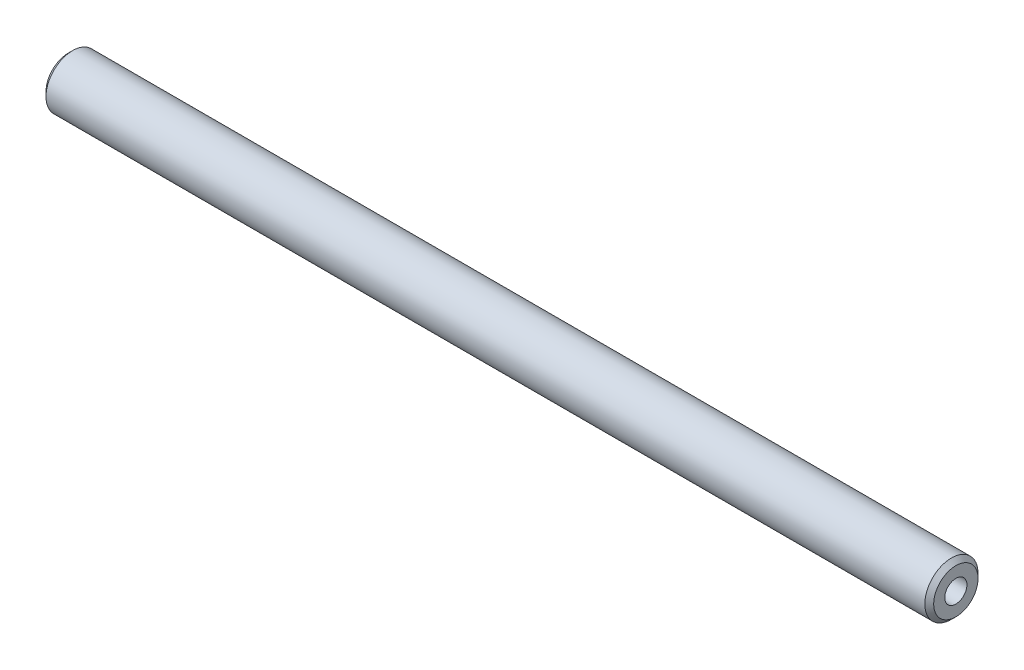
ISO-10303-21;
HEADER;
FILE_DESCRIPTION(('STEP AP214'),'2;1');
FILE_NAME('part.step','',(''),(''),'','','');
FILE_SCHEMA(('AUTOMOTIVE_DESIGN { 1 0 10303 214 1 1 1 1 }'));
ENDSEC;
DATA;
#1=APPLICATION_CONTEXT('core data for automotive mechanical design processes');
#2=APPLICATION_PROTOCOL_DEFINITION('international standard','automotive_design',2000,#1);
#3=PRODUCT_CONTEXT('',#1,'mechanical');
#4=PRODUCT('Part','Part','',(#3));
#5=PRODUCT_RELATED_PRODUCT_CATEGORY('part','',(#4));
#6=PRODUCT_DEFINITION_FORMATION('','',#4);
#7=PRODUCT_DEFINITION_CONTEXT('part definition',#1,'design');
#8=PRODUCT_DEFINITION('design','',#6,#7);
#9=PRODUCT_DEFINITION_SHAPE('','',#8);
#10=(LENGTH_UNIT() NAMED_UNIT(*) SI_UNIT(.MILLI.,.METRE.));
#11=(NAMED_UNIT(*) PLANE_ANGLE_UNIT() SI_UNIT($,.RADIAN.));
#12=(NAMED_UNIT(*) SI_UNIT($,.STERADIAN.) SOLID_ANGLE_UNIT());
#13=UNCERTAINTY_MEASURE_WITH_UNIT(LENGTH_MEASURE(1.E-05),#10,'distance_accuracy_value','');
#14=(GEOMETRIC_REPRESENTATION_CONTEXT(3) GLOBAL_UNCERTAINTY_ASSIGNED_CONTEXT((#13)) GLOBAL_UNIT_ASSIGNED_CONTEXT((#10,
#11,#12)) REPRESENTATION_CONTEXT('',''));
#15=CARTESIAN_POINT('',(0.,0.,0.));
#16=DIRECTION('',(0.,0.,1.));
#17=DIRECTION('',(1.,0.,0.));
#18=AXIS2_PLACEMENT_3D('',#15,#16,#17);
#19=CARTESIAN_POINT('',(0.,0.,0.));
#20=DIRECTION('',(1.,0.,0.));
#21=DIRECTION('',(0.,0.,-1.));
#22=AXIS2_PLACEMENT_3D('',#19,#20,#21);
#23=PLANE('',#22);
#24=CARTESIAN_POINT('',(0.,0.,0.));
#25=DIRECTION('',(1.,0.,0.));
#26=DIRECTION('',(0.,0.,-1.));
#27=AXIS2_PLACEMENT_3D('',#24,#25,#26);
#28=CIRCLE('',#27,2.5);
#29=CARTESIAN_POINT('',(0.,0.,-2.5));
#30=VERTEX_POINT('',#29);
#31=EDGE_CURVE('E82',#30,#30,#28,.F.);
#32=ORIENTED_EDGE('',*,*,#31,.T.);
#33=EDGE_LOOP('',(#32));
#34=FACE_BOUND('',#33,.T.);
#35=CARTESIAN_POINT('',(0.,0.,0.));
#36=DIRECTION('',(-1.,0.,0.));
#37=DIRECTION('',(0.,0.,1.));
#38=AXIS2_PLACEMENT_3D('',#35,#36,#37);
#39=CIRCLE('',#38,1.25);
#40=CARTESIAN_POINT('',(0.,0.,1.25));
#41=VERTEX_POINT('',#40);
#42=EDGE_CURVE('E70',#41,#41,#39,.T.);
#43=ORIENTED_EDGE('',*,*,#42,.F.);
#44=EDGE_LOOP('',(#43));
#45=FACE_BOUND('',#44,.T.);
#46=ADVANCED_FACE('F45',(#34,#45),#23,.F.);
#47=CARTESIAN_POINT('',(0.,0.,0.));
#48=DIRECTION('',(-1.,0.,0.));
#49=DIRECTION('',(0.,0.,1.));
#50=AXIS2_PLACEMENT_3D('',#47,#48,#49);
#51=CYLINDRICAL_SURFACE('',#50,3.);
#52=CARTESIAN_POINT('',(0.500000000000009,0.,0.));
#53=DIRECTION('',(1.,0.,0.));
#54=DIRECTION('',(0.,0.,-1.));
#55=AXIS2_PLACEMENT_3D('',#52,#53,#54);
#56=CIRCLE('',#55,3.);
#57=CARTESIAN_POINT('',(0.500000000000009,0.,-3.));
#58=VERTEX_POINT('',#57);
#59=EDGE_CURVE('E53',#58,#58,#56,.T.);
#60=ORIENTED_EDGE('',*,*,#59,.T.);
#61=EDGE_LOOP('',(#60));
#62=FACE_BOUND('',#61,.T.);
#63=CARTESIAN_POINT('',(99.5,0.,0.));
#64=DIRECTION('',(-1.,0.,0.));
#65=DIRECTION('',(0.,0.,1.));
#66=AXIS2_PLACEMENT_3D('',#63,#64,#65);
#67=CIRCLE('',#66,3.);
#68=CARTESIAN_POINT('',(99.5,0.,3.));
#69=VERTEX_POINT('',#68);
#70=EDGE_CURVE('E85',#69,#69,#67,.T.);
#71=ORIENTED_EDGE('',*,*,#70,.T.);
#72=EDGE_LOOP('',(#71));
#73=FACE_BOUND('',#72,.T.);
#74=ADVANCED_FACE('F90',(#62,#73),#51,.T.);
#75=CARTESIAN_POINT('',(100.,0.,0.));
#76=DIRECTION('',(-1.,0.,0.));
#77=DIRECTION('',(0.,0.,1.));
#78=AXIS2_PLACEMENT_3D('',#75,#76,#77);
#79=PLANE('',#78);
#80=CARTESIAN_POINT('',(100.,0.,0.));
#81=DIRECTION('',(-1.,0.,0.));
#82=DIRECTION('',(0.,0.,1.));
#83=AXIS2_PLACEMENT_3D('',#80,#81,#82);
#84=CIRCLE('',#83,2.50000000000004);
#85=CARTESIAN_POINT('',(100.,0.,2.50000000000004));
#86=VERTEX_POINT('',#85);
#87=EDGE_CURVE('E11',#86,#86,#84,.F.);
#88=ORIENTED_EDGE('',*,*,#87,.T.);
#89=EDGE_LOOP('',(#88));
#90=FACE_BOUND('',#89,.T.);
#91=CARTESIAN_POINT('',(100.,0.,0.));
#92=DIRECTION('',(1.,0.,0.));
#93=DIRECTION('',(0.,0.,-1.));
#94=AXIS2_PLACEMENT_3D('',#91,#92,#93);
#95=CIRCLE('',#94,1.24999999999999);
#96=CARTESIAN_POINT('',(100.,0.,-1.24999999999999));
#97=VERTEX_POINT('',#96);
#98=EDGE_CURVE('E71',#97,#97,#95,.T.);
#99=ORIENTED_EDGE('',*,*,#98,.F.);
#100=EDGE_LOOP('',(#99));
#101=FACE_BOUND('',#100,.T.);
#102=ADVANCED_FACE('F110',(#90,#101),#79,.F.);
#103=CARTESIAN_POINT('',(8.5,0.,0.));
#104=DIRECTION('',(-1.,0.,0.));
#105=DIRECTION('',(0.,0.,1.));
#106=AXIS2_PLACEMENT_3D('',#103,#104,#105);
#107=CONICAL_SURFACE('',#106,1.25,1.02974425867666);
#108=CARTESIAN_POINT('',(9.25107577378445,0.,0.));
#109=VERTEX_POINT('',#108);
#110=VERTEX_LOOP('',#109);
#111=FACE_BOUND('',#110,.T.);
#112=CARTESIAN_POINT('',(8.5,0.,0.));
#113=DIRECTION('',(-1.,0.,0.));
#114=DIRECTION('',(0.,0.,1.));
#115=AXIS2_PLACEMENT_3D('',#112,#113,#114);
#116=CIRCLE('',#115,1.25);
#117=CARTESIAN_POINT('',(8.5,0.,1.25));
#118=VERTEX_POINT('',#117);
#119=EDGE_CURVE('E74',#118,#118,#116,.T.);
#120=ORIENTED_EDGE('',*,*,#119,.T.);
#121=EDGE_LOOP('',(#120));
#122=FACE_BOUND('',#121,.T.);
#123=ADVANCED_FACE('F104',(#111,#122),#107,.F.);
#124=CARTESIAN_POINT('',(0.,0.,0.));
#125=DIRECTION('',(-1.,0.,0.));
#126=DIRECTION('',(0.,0.,1.));
#127=AXIS2_PLACEMENT_3D('',#124,#125,#126);
#128=CYLINDRICAL_SURFACE('',#127,1.25);
#129=ORIENTED_EDGE('',*,*,#119,.F.);
#130=EDGE_LOOP('',(#129));
#131=FACE_BOUND('',#130,.T.);
#132=ORIENTED_EDGE('',*,*,#42,.T.);
#133=EDGE_LOOP('',(#132));
#134=FACE_BOUND('',#133,.T.);
#135=ADVANCED_FACE('F64',(#131,#134),#128,.F.);
#136=CARTESIAN_POINT('',(91.5,0.,0.));
#137=DIRECTION('',(1.,0.,0.));
#138=DIRECTION('',(0.,0.,-1.));
#139=AXIS2_PLACEMENT_3D('',#136,#137,#138);
#140=CONICAL_SURFACE('',#139,1.24999999999999,1.02974425867665);
#141=CARTESIAN_POINT('',(90.7489242262156,0.,0.));
#142=VERTEX_POINT('',#141);
#143=VERTEX_LOOP('',#142);
#144=FACE_BOUND('',#143,.T.);
#145=CARTESIAN_POINT('',(91.5,0.,0.));
#146=DIRECTION('',(1.,0.,0.));
#147=DIRECTION('',(0.,0.,-1.));
#148=AXIS2_PLACEMENT_3D('',#145,#146,#147);
#149=CIRCLE('',#148,1.24999999999999);
#150=CARTESIAN_POINT('',(91.5,0.,-1.24999999999999));
#151=VERTEX_POINT('',#150);
#152=EDGE_CURVE('E68',#151,#151,#149,.T.);
#153=ORIENTED_EDGE('',*,*,#152,.T.);
#154=EDGE_LOOP('',(#153));
#155=FACE_BOUND('',#154,.T.);
#156=ADVANCED_FACE('F60',(#144,#155),#140,.F.);
#157=CARTESIAN_POINT('',(100.,0.,0.));
#158=DIRECTION('',(1.,0.,0.));
#159=DIRECTION('',(0.,0.,-1.));
#160=AXIS2_PLACEMENT_3D('',#157,#158,#159);
#161=CYLINDRICAL_SURFACE('',#160,1.24999999999999);
#162=ORIENTED_EDGE('',*,*,#152,.F.);
#163=EDGE_LOOP('',(#162));
#164=FACE_BOUND('',#163,.T.);
#165=ORIENTED_EDGE('',*,*,#98,.T.);
#166=EDGE_LOOP('',(#165));
#167=FACE_BOUND('',#166,.T.);
#168=ADVANCED_FACE('F63',(#164,#167),#161,.F.);
#169=CARTESIAN_POINT('',(0.,0.,0.));
#170=DIRECTION('',(1.,0.,0.));
#171=DIRECTION('',(0.,0.,-1.));
#172=AXIS2_PLACEMENT_3D('',#169,#170,#171);
#173=CONICAL_SURFACE('',#172,2.5,0.785398163397438);
#174=ORIENTED_EDGE('',*,*,#59,.F.);
#175=EDGE_LOOP('',(#174));
#176=FACE_BOUND('',#175,.T.);
#177=ORIENTED_EDGE('',*,*,#31,.F.);
#178=EDGE_LOOP('',(#177));
#179=FACE_BOUND('',#178,.T.);
#180=ADVANCED_FACE('F93',(#176,#179),#173,.T.);
#181=CARTESIAN_POINT('',(99.5,0.,0.));
#182=DIRECTION('',(-1.,0.,0.));
#183=DIRECTION('',(0.,0.,1.));
#184=AXIS2_PLACEMENT_3D('',#181,#182,#183);
#185=CONICAL_SURFACE('',#184,3.,0.785398163397446);
#186=ORIENTED_EDGE('',*,*,#87,.F.);
#187=EDGE_LOOP('',(#186));
#188=FACE_BOUND('',#187,.T.);
#189=ORIENTED_EDGE('',*,*,#70,.F.);
#190=EDGE_LOOP('',(#189));
#191=FACE_BOUND('',#190,.T.);
#192=ADVANCED_FACE('F47',(#188,#191),#185,.T.);
#193=CLOSED_SHELL('',(#46,#74,#102,#123,#135,#156,#168,#180,#192));
#194=MANIFOLD_SOLID_BREP('B2',#193);
#195=ADVANCED_BREP_SHAPE_REPRESENTATION('',(#18,#194),#14);
#196=SHAPE_DEFINITION_REPRESENTATION(#9,#195);
ENDSEC;
END-ISO-10303-21;
